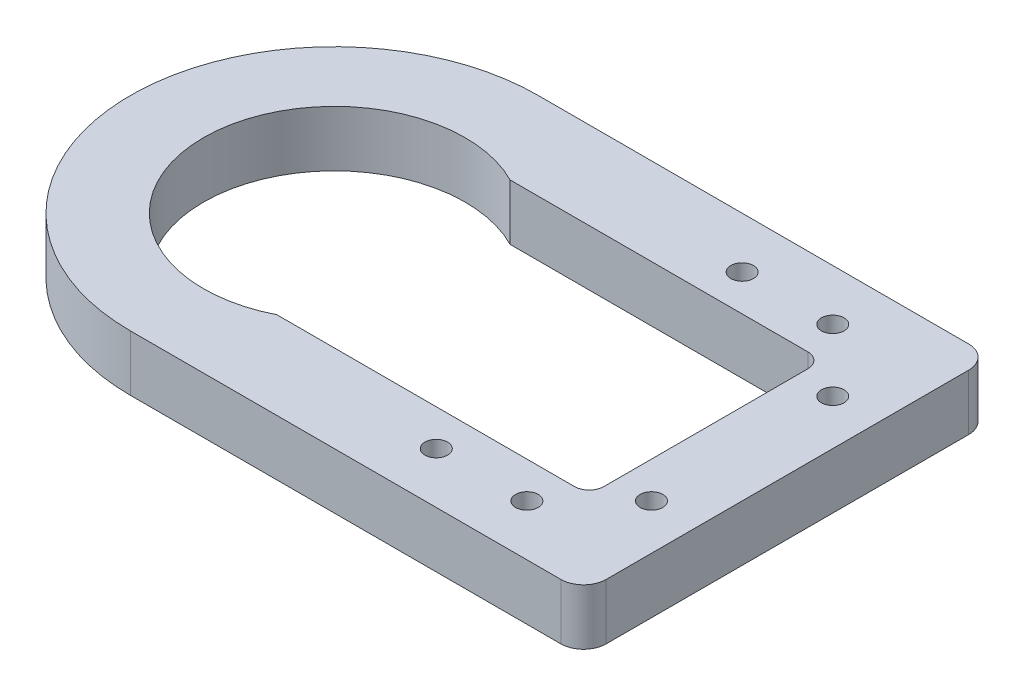
ISO-10303-21;
HEADER;
FILE_DESCRIPTION(('STEP AP214'),'2;1');
FILE_NAME('part.step','',(''),(''),'','','');
FILE_SCHEMA(('AUTOMOTIVE_DESIGN { 1 0 10303 214 1 1 1 1 }'));
ENDSEC;
DATA;
#1=APPLICATION_CONTEXT('core data for automotive mechanical design processes');
#2=APPLICATION_PROTOCOL_DEFINITION('international standard','automotive_design',2000,#1);
#3=PRODUCT_CONTEXT('',#1,'mechanical');
#4=PRODUCT('Part','Part','',(#3));
#5=PRODUCT_RELATED_PRODUCT_CATEGORY('part','',(#4));
#6=PRODUCT_DEFINITION_FORMATION('','',#4);
#7=PRODUCT_DEFINITION_CONTEXT('part definition',#1,'design');
#8=PRODUCT_DEFINITION('design','',#6,#7);
#9=PRODUCT_DEFINITION_SHAPE('','',#8);
#10=(LENGTH_UNIT() NAMED_UNIT(*) SI_UNIT(.MILLI.,.METRE.));
#11=(NAMED_UNIT(*) PLANE_ANGLE_UNIT() SI_UNIT($,.RADIAN.));
#12=(NAMED_UNIT(*) SI_UNIT($,.STERADIAN.) SOLID_ANGLE_UNIT());
#13=UNCERTAINTY_MEASURE_WITH_UNIT(LENGTH_MEASURE(1.E-05),#10,'distance_accuracy_value','');
#14=(GEOMETRIC_REPRESENTATION_CONTEXT(3) GLOBAL_UNCERTAINTY_ASSIGNED_CONTEXT((#13)) GLOBAL_UNIT_ASSIGNED_CONTEXT((#10,
#11,#12)) REPRESENTATION_CONTEXT('',''));
#15=CARTESIAN_POINT('',(0.,0.,0.));
#16=DIRECTION('',(0.,0.,1.));
#17=DIRECTION('',(1.,0.,0.));
#18=AXIS2_PLACEMENT_3D('',#15,#16,#17);
#19=CARTESIAN_POINT('',(-18.0100000019727,4.9304,-1.09601216990995E-09));
#20=DIRECTION('',(0.,1.,0.));
#21=DIRECTION('',(0.,0.,1.));
#22=AXIS2_PLACEMENT_3D('',#19,#20,#21);
#23=PLANE('',#22);
#24=CARTESIAN_POINT('',(22.5001886971539,4.9304,-13.5001144870717));
#25=DIRECTION('',(0.,-1.,0.));
#26=DIRECTION('',(-1.,0.,0.));
#27=AXIS2_PLACEMENT_3D('',#24,#25,#26);
#28=CIRCLE('',#27,0.999999999999983);
#29=CARTESIAN_POINT('',(23.5001886971539,4.9304,-13.5001144870717));
#30=VERTEX_POINT('',#29);
#31=EDGE_CURVE('E20',#30,#30,#28,.T.);
#32=ORIENTED_EDGE('',*,*,#31,.T.);
#33=EDGE_LOOP('',(#32));
#34=FACE_BOUND('',#33,.T.);
#35=CARTESIAN_POINT('',(22.5001886971539,4.9304,13.4998855129283));
#36=DIRECTION('',(0.,-1.,0.));
#37=DIRECTION('',(-1.,0.,0.));
#38=AXIS2_PLACEMENT_3D('',#35,#36,#37);
#39=CIRCLE('',#38,0.999999999999983);
#40=CARTESIAN_POINT('',(23.5001886971539,4.9304,13.4998855129283));
#41=VERTEX_POINT('',#40);
#42=EDGE_CURVE('E96',#41,#41,#39,.T.);
#43=ORIENTED_EDGE('',*,*,#42,.T.);
#44=EDGE_LOOP('',(#43));
#45=FACE_BOUND('',#44,.T.);
#46=CARTESIAN_POINT('',(30.5001886971539,4.9304,-13.5001144870717));
#47=DIRECTION('',(0.,-1.,0.));
#48=DIRECTION('',(-1.,0.,0.));
#49=AXIS2_PLACEMENT_3D('',#46,#47,#48);
#50=CIRCLE('',#49,1.0000000000001);
#51=CARTESIAN_POINT('',(31.500188697154,4.9304,-13.5001144870717));
#52=VERTEX_POINT('',#51);
#53=EDGE_CURVE('E198',#52,#52,#50,.T.);
#54=ORIENTED_EDGE('',*,*,#53,.T.);
#55=EDGE_LOOP('',(#54));
#56=FACE_BOUND('',#55,.T.);
#57=CARTESIAN_POINT('',(36.0001886971538,4.9304,-8.00011448707169));
#58=DIRECTION('',(0.,-1.,0.));
#59=DIRECTION('',(-1.,0.,0.));
#60=AXIS2_PLACEMENT_3D('',#57,#58,#59);
#61=CIRCLE('',#60,0.999999999999908);
#62=CARTESIAN_POINT('',(37.0001886971537,4.9304,-8.0001144870717));
#63=VERTEX_POINT('',#62);
#64=EDGE_CURVE('E228',#63,#63,#61,.T.);
#65=ORIENTED_EDGE('',*,*,#64,.T.);
#66=EDGE_LOOP('',(#65));
#67=FACE_BOUND('',#66,.T.);
#68=CARTESIAN_POINT('',(30.5001886971539,4.9304,13.4998855129283));
#69=DIRECTION('',(0.,-1.,0.));
#70=DIRECTION('',(-1.,0.,0.));
#71=AXIS2_PLACEMENT_3D('',#68,#69,#70);
#72=CIRCLE('',#71,1.00000000000011);
#73=CARTESIAN_POINT('',(31.500188697154,4.9304,13.4998855129283));
#74=VERTEX_POINT('',#73);
#75=EDGE_CURVE('E182',#74,#74,#72,.T.);
#76=ORIENTED_EDGE('',*,*,#75,.T.);
#77=EDGE_LOOP('',(#76));
#78=FACE_BOUND('',#77,.T.);
#79=CARTESIAN_POINT('',(36.0001886971538,4.9304,7.99988551292829));
#80=DIRECTION('',(0.,-1.,0.));
#81=DIRECTION('',(-1.,0.,0.));
#82=AXIS2_PLACEMENT_3D('',#79,#80,#81);
#83=CIRCLE('',#82,0.999999999999885);
#84=CARTESIAN_POINT('',(37.0001886971537,4.9304,7.99988551292829));
#85=VERTEX_POINT('',#84);
#86=EDGE_CURVE('E208',#85,#85,#83,.T.);
#87=ORIENTED_EDGE('',*,*,#86,.T.);
#88=EDGE_LOOP('',(#87));
#89=FACE_BOUND('',#88,.T.);
#90=CARTESIAN_POINT('',(0.,4.9304,-1.96509475358653E-12));
#91=DIRECTION('',(0.,-1.,0.));
#92=DIRECTION('',(0.452458420498872,0.,-0.891785499837077));
#93=AXIS2_PLACEMENT_3D('',#90,#91,#92);
#94=CIRCLE('',#93,11.5499909828917);
#95=CARTESIAN_POINT('',(5.22634193926225,4.9304,10.2998855158078));
#96=VERTEX_POINT('',#95);
#97=CARTESIAN_POINT('',(5.22589067689541,4.9304,-10.3001144817938));
#98=VERTEX_POINT('',#97);
#99=EDGE_CURVE('E186',#96,#98,#94,.T.);
#100=ORIENTED_EDGE('',*,*,#99,.T.);
#101=DIRECTION('',(1.,0.,-2.00831132028612E-10));
#102=VECTOR('',#101,1.);
#103=CARTESIAN_POINT('',(0.176519849998757,4.9304,-10.3001144807797));
#104=LINE('',#103,#102);
#105=CARTESIAN_POINT('',(31.5001887311821,4.9304,-10.3001144870705));
#106=VERTEX_POINT('',#105);
#107=EDGE_CURVE('E181',#98,#106,#104,.T.);
#108=ORIENTED_EDGE('',*,*,#107,.T.);
#109=CARTESIAN_POINT('',(31.5001886971546,4.9304,-9.0001144870712));
#110=DIRECTION('',(0.,-1.,0.));
#111=DIRECTION('',(1.,0.,2.42301905036031E-11));
#112=AXIS2_PLACEMENT_3D('',#109,#110,#111);
#113=CIRCLE('',#112,1.29999999999921);
#114=CARTESIAN_POINT('',(32.8001886971538,4.9304,-9.0001144870397));
#115=VERTEX_POINT('',#114);
#116=EDGE_CURVE('E75',#106,#115,#113,.T.);
#117=ORIENTED_EDGE('',*,*,#116,.T.);
#118=DIRECTION('',(-1.103675047943E-10,0.,1.));
#119=VECTOR('',#118,1.);
#120=CARTESIAN_POINT('',(32.8001886961607,4.9304,-5.72329382744409E-05));
#121=LINE('',#120,#119);
#122=CARTESIAN_POINT('',(32.8001886951673,4.9304,8.99988554626301));
#123=VERTEX_POINT('',#122);
#124=EDGE_CURVE('E156',#115,#123,#121,.T.);
#125=ORIENTED_EDGE('',*,*,#124,.T.);
#126=CARTESIAN_POINT('',(31.5001886951672,4.9304,8.99988551292821));
#127=DIRECTION('',(0.,-1.,0.));
#128=DIRECTION('',(0.,0.,1.));
#129=AXIS2_PLACEMENT_3D('',#126,#127,#128);
#130=CIRCLE('',#129,1.30000000000008);
#131=CARTESIAN_POINT('',(31.5001886951672,4.9304,10.2998855129283));
#132=VERTEX_POINT('',#131);
#133=EDGE_CURVE('E144',#123,#132,#130,.T.);
#134=ORIENTED_EDGE('',*,*,#133,.T.);
#135=DIRECTION('',(-1.,0.,1.09595282378894E-10));
#136=VECTOR('',#135,1.);
#137=CARTESIAN_POINT('',(0.176632658185377,4.9304,10.2998855163613));
#138=LINE('',#137,#136);
#139=EDGE_CURVE('E174',#132,#96,#138,.T.);
#140=ORIENTED_EDGE('',*,*,#139,.T.);
#141=EDGE_LOOP('',(#100,#108,#117,#125,#134,#140));
#142=FACE_BOUND('',#141,.T.);
#143=DIRECTION('',(1.,0.,-1.09599453254686E-10));
#144=VECTOR('',#143,1.);
#145=CARTESIAN_POINT('',(0.495000000493232,4.9304,17.9999999999458));
#146=LINE('',#145,#144);
#147=CARTESIAN_POINT('',(1.97275797694102E-09,4.9304,18.));
#148=VERTEX_POINT('',#147);
#149=CARTESIAN_POINT('',(38.,4.9304,17.9999999958352));
#150=VERTEX_POINT('',#149);
#151=EDGE_CURVE('E11',#148,#150,#146,.T.);
#152=ORIENTED_EDGE('',*,*,#151,.T.);
#153=CARTESIAN_POINT('',(37.9999999998903,4.9304,15.9999999959448));
#154=DIRECTION('',(0.,1.,0.));
#155=DIRECTION('',(5.48006084984981E-11,0.,1.));
#156=AXIS2_PLACEMENT_3D('',#153,#154,#155);
#157=CIRCLE('',#156,1.9999999998905);
#158=CARTESIAN_POINT('',(39.9999999997808,4.9304,15.999999995616));
#159=VERTEX_POINT('',#158);
#160=EDGE_CURVE('E172',#150,#159,#157,.T.);
#161=ORIENTED_EDGE('',*,*,#160,.T.);
#162=DIRECTION('',(-1.09595863510827E-10,0.,-1.));
#163=VECTOR('',#162,1.);
#164=CARTESIAN_POINT('',(39.9999999980272,4.9304,-5.91881514720845E-09));
#165=LINE('',#164,#163);
#166=CARTESIAN_POINT('',(39.9999999962736,4.9304,-16.000000004384));
#167=VERTEX_POINT('',#166);
#168=EDGE_CURVE('E166',#159,#167,#165,.T.);
#169=ORIENTED_EDGE('',*,*,#168,.T.);
#170=CARTESIAN_POINT('',(37.9999999962735,4.9304,-16.0000000041648));
#171=DIRECTION('',(0.,1.,0.));
#172=DIRECTION('',(1.,0.,-1.09602327214015E-10));
#173=AXIS2_PLACEMENT_3D('',#170,#171,#172);
#174=CIRCLE('',#173,2.0000000000001);
#175=CARTESIAN_POINT('',(37.9999999962737,4.9304,-18.0000000041647));
#176=VERTEX_POINT('',#175);
#177=EDGE_CURVE('E194',#167,#176,#174,.T.);
#178=ORIENTED_EDGE('',*,*,#177,.T.);
#179=DIRECTION('',(-1.,0.,1.09600095676636E-10));
#180=VECTOR('',#179,1.);
#181=CARTESIAN_POINT('',(0.494999996602441,4.9304,-18.0000000000542));
#182=LINE('',#181,#180);
#183=CARTESIAN_POINT('',(-1.97276884064679E-09,4.9304,-18.));
#184=VERTEX_POINT('',#183);
#185=EDGE_CURVE('E236',#176,#184,#182,.T.);
#186=ORIENTED_EDGE('',*,*,#185,.T.);
#187=CARTESIAN_POINT('',(0.,4.9304,0.));
#188=DIRECTION('',(0.,1.,0.));
#189=DIRECTION('',(-1.09599780714268E-10,0.,-1.));
#190=AXIS2_PLACEMENT_3D('',#187,#188,#189);
#191=CIRCLE('',#190,18.);
#192=EDGE_CURVE('E205',#184,#148,#191,.T.);
#193=ORIENTED_EDGE('',*,*,#192,.T.);
#194=EDGE_LOOP('',(#152,#161,#169,#178,#186,#193));
#195=FACE_BOUND('',#194,.T.);
#196=ADVANCED_FACE('F16',(#34,#45,#56,#67,#78,#89,#142,#195),#23,.T.);
#197=CARTESIAN_POINT('',(-18.0100000019727,0.,-1.09600772901786E-09));
#198=DIRECTION('',(0.,-1.,0.));
#199=DIRECTION('',(0.,0.,-1.));
#200=AXIS2_PLACEMENT_3D('',#197,#198,#199);
#201=PLANE('',#200);
#202=CARTESIAN_POINT('',(22.5001886971539,0.,-13.5001144870717));
#203=DIRECTION('',(0.,1.,0.));
#204=DIRECTION('',(-0.813826036051077,0.,-0.581108581114917));
#205=AXIS2_PLACEMENT_3D('',#202,#203,#204);
#206=CIRCLE('',#205,1.);
#207=CARTESIAN_POINT('',(21.5001886971539,0.,-13.5001144870717));
#208=VERTEX_POINT('',#207);
#209=EDGE_CURVE('E243',#208,#208,#206,.T.);
#210=ORIENTED_EDGE('',*,*,#209,.T.);
#211=EDGE_LOOP('',(#210));
#212=FACE_BOUND('',#211,.T.);
#213=CARTESIAN_POINT('',(22.5001886971539,0.,13.4998855129284));
#214=DIRECTION('',(0.,1.,0.));
#215=DIRECTION('',(-0.813826036051071,0.,-0.581108581114924));
#216=AXIS2_PLACEMENT_3D('',#213,#214,#215);
#217=CIRCLE('',#216,1.);
#218=CARTESIAN_POINT('',(21.5001886971539,0.,13.4998855129283));
#219=VERTEX_POINT('',#218);
#220=EDGE_CURVE('E87',#219,#219,#217,.T.);
#221=ORIENTED_EDGE('',*,*,#220,.T.);
#222=EDGE_LOOP('',(#221));
#223=FACE_BOUND('',#222,.T.);
#224=CARTESIAN_POINT('',(30.5001886971539,0.,-13.5001144870716));
#225=DIRECTION('',(0.,1.,0.));
#226=DIRECTION('',(-0.81382603605107,0.,-0.581108581114926));
#227=AXIS2_PLACEMENT_3D('',#224,#225,#226);
#228=CIRCLE('',#227,1.00000000000006);
#229=CARTESIAN_POINT('',(29.5001886971539,0.,-13.5001144870717));
#230=VERTEX_POINT('',#229);
#231=EDGE_CURVE('E196',#230,#230,#228,.T.);
#232=ORIENTED_EDGE('',*,*,#231,.T.);
#233=EDGE_LOOP('',(#232));
#234=FACE_BOUND('',#233,.T.);
#235=CARTESIAN_POINT('',(36.0001886971539,0.,-8.00011448707171));
#236=DIRECTION('',(0.,1.,0.));
#237=DIRECTION('',(-0.813826036051058,0.,-0.581108581114943));
#238=AXIS2_PLACEMENT_3D('',#235,#236,#237);
#239=CIRCLE('',#238,0.999999999999947);
#240=CARTESIAN_POINT('',(35.000188697154,0.,-8.00011448707169));
#241=VERTEX_POINT('',#240);
#242=EDGE_CURVE('E226',#241,#241,#239,.T.);
#243=ORIENTED_EDGE('',*,*,#242,.T.);
#244=EDGE_LOOP('',(#243));
#245=FACE_BOUND('',#244,.T.);
#246=CARTESIAN_POINT('',(30.5001886971539,0.,13.4998855129284));
#247=DIRECTION('',(0.,1.,0.));
#248=DIRECTION('',(-0.813826036051069,0.,-0.581108581114928));
#249=AXIS2_PLACEMENT_3D('',#246,#247,#248);
#250=CIRCLE('',#249,1.00000000000005);
#251=CARTESIAN_POINT('',(29.5001886971539,0.,13.4998855129283));
#252=VERTEX_POINT('',#251);
#253=EDGE_CURVE('E184',#252,#252,#250,.T.);
#254=ORIENTED_EDGE('',*,*,#253,.T.);
#255=EDGE_LOOP('',(#254));
#256=FACE_BOUND('',#255,.T.);
#257=CARTESIAN_POINT('',(36.0001886971538,0.,7.99988551292829));
#258=DIRECTION('',(0.,1.,0.));
#259=DIRECTION('',(-0.813826036051057,0.,-0.581108581114945));
#260=AXIS2_PLACEMENT_3D('',#257,#258,#259);
#261=CIRCLE('',#260,0.999999999999944);
#262=CARTESIAN_POINT('',(35.000188697154,0.,7.99988551292829));
#263=VERTEX_POINT('',#262);
#264=EDGE_CURVE('E185',#263,#263,#261,.T.);
#265=ORIENTED_EDGE('',*,*,#264,.T.);
#266=EDGE_LOOP('',(#265));
#267=FACE_BOUND('',#266,.T.);
#268=CARTESIAN_POINT('',(0.,0.,-1.95621296938953E-12));
#269=DIRECTION('',(0.,1.,0.));
#270=DIRECTION('',(0.452497490864166,0.,0.891765675927053));
#271=AXIS2_PLACEMENT_3D('',#268,#269,#270);
#272=CIRCLE('',#271,11.5499909828917);
#273=CARTESIAN_POINT('',(5.22589067689541,0.,-10.3001144817938));
#274=VERTEX_POINT('',#273);
#275=CARTESIAN_POINT('',(5.22634193926225,0.,10.2998855158078));
#276=VERTEX_POINT('',#275);
#277=EDGE_CURVE('E199',#274,#276,#272,.T.);
#278=ORIENTED_EDGE('',*,*,#277,.T.);
#279=DIRECTION('',(1.,0.,-1.09595463787011E-10));
#280=VECTOR('',#279,1.);
#281=CARTESIAN_POINT('',(5.22634193926225,0.,10.2998855158078));
#282=LINE('',#281,#280);
#283=CARTESIAN_POINT('',(31.5001886951672,0.,10.2998855129283));
#284=VERTEX_POINT('',#283);
#285=EDGE_CURVE('E154',#276,#284,#282,.T.);
#286=ORIENTED_EDGE('',*,*,#285,.T.);
#287=CARTESIAN_POINT('',(31.5001886951673,0.,8.99988551292828));
#288=DIRECTION('',(0.,1.,0.));
#289=DIRECTION('',(1.,0.,2.56420987007834E-08));
#290=AXIS2_PLACEMENT_3D('',#287,#288,#289);
#291=CIRCLE('',#290,1.3);
#292=CARTESIAN_POINT('',(32.8001886951673,0.,8.99988554626301));
#293=VERTEX_POINT('',#292);
#294=EDGE_CURVE('E159',#284,#293,#291,.T.);
#295=ORIENTED_EDGE('',*,*,#294,.T.);
#296=DIRECTION('',(1.103628297817E-10,0.,-1.));
#297=VECTOR('',#296,1.);
#298=CARTESIAN_POINT('',(32.8001886951673,0.,8.99988554626301));
#299=LINE('',#298,#297);
#300=CARTESIAN_POINT('',(32.8001886971538,0.,-9.0001144870397));
#301=VERTEX_POINT('',#300);
#302=EDGE_CURVE('E64',#293,#301,#299,.T.);
#303=ORIENTED_EDGE('',*,*,#302,.T.);
#304=CARTESIAN_POINT('',(31.5001886971545,0.,-9.00011448707114));
#305=DIRECTION('',(0.,1.,0.));
#306=DIRECTION('',(2.61750791981399E-08,0.,-1.));
#307=AXIS2_PLACEMENT_3D('',#304,#305,#306);
#308=CIRCLE('',#307,1.29999999999935);
#309=CARTESIAN_POINT('',(31.5001887311821,0.,-10.3001144870705));
#310=VERTEX_POINT('',#309);
#311=EDGE_CURVE('E178',#301,#310,#308,.T.);
#312=ORIENTED_EDGE('',*,*,#311,.T.);
#313=DIRECTION('',(-1.,0.,2.00831210286976E-10));
#314=VECTOR('',#313,1.);
#315=CARTESIAN_POINT('',(31.5001887311821,0.,-10.3001144870705));
#316=LINE('',#315,#314);
#317=EDGE_CURVE('E214',#310,#274,#316,.T.);
#318=ORIENTED_EDGE('',*,*,#317,.T.);
#319=EDGE_LOOP('',(#278,#286,#295,#303,#312,#318));
#320=FACE_BOUND('',#319,.T.);
#321=DIRECTION('',(-1.,0.,1.09599697744126E-10));
#322=VECTOR('',#321,1.);
#323=CARTESIAN_POINT('',(38.,0.,17.9999999958352));
#324=LINE('',#323,#322);
#325=CARTESIAN_POINT('',(38.,0.,17.9999999958352));
#326=VERTEX_POINT('',#325);
#327=CARTESIAN_POINT('',(1.97275844097955E-09,0.,18.));
#328=VERTEX_POINT('',#327);
#329=EDGE_CURVE('E26',#326,#328,#324,.T.);
#330=ORIENTED_EDGE('',*,*,#329,.T.);
#331=CARTESIAN_POINT('',(0.,0.,0.));
#332=DIRECTION('',(0.,-1.,0.));
#333=DIRECTION('',(-1.09599966445788E-10,0.,-1.));
#334=AXIS2_PLACEMENT_3D('',#331,#332,#333);
#335=CIRCLE('',#334,18.);
#336=CARTESIAN_POINT('',(-1.97276906616084E-09,0.,-18.));
#337=VERTEX_POINT('',#336);
#338=EDGE_CURVE('E206',#328,#337,#335,.T.);
#339=ORIENTED_EDGE('',*,*,#338,.T.);
#340=DIRECTION('',(1.,0.,-1.09599639310702E-10));
#341=VECTOR('',#340,1.);
#342=CARTESIAN_POINT('',(-1.97276906616084E-09,0.,-18.));
#343=LINE('',#342,#341);
#344=CARTESIAN_POINT('',(37.9999999962737,0.,-18.0000000041647));
#345=VERTEX_POINT('',#344);
#346=EDGE_CURVE('E231',#337,#345,#343,.T.);
#347=ORIENTED_EDGE('',*,*,#346,.T.);
#348=CARTESIAN_POINT('',(37.9999999962736,0.,-16.0000000041648));
#349=DIRECTION('',(0.,-1.,0.));
#350=DIRECTION('',(1.,0.,-1.09566800077236E-10));
#351=AXIS2_PLACEMENT_3D('',#348,#349,#350);
#352=CIRCLE('',#351,1.99999999999993);
#353=CARTESIAN_POINT('',(39.9999999962736,0.,-16.000000004384));
#354=VERTEX_POINT('',#353);
#355=EDGE_CURVE('E191',#345,#354,#352,.T.);
#356=ORIENTED_EDGE('',*,*,#355,.T.);
#357=DIRECTION('',(1.09601078213117E-10,0.,1.));
#358=VECTOR('',#357,1.);
#359=CARTESIAN_POINT('',(39.9999999962736,0.,-16.000000004384));
#360=LINE('',#359,#358);
#361=CARTESIAN_POINT('',(39.9999999997808,0.,15.999999995616));
#362=VERTEX_POINT('',#361);
#363=EDGE_CURVE('E169',#354,#362,#360,.T.);
#364=ORIENTED_EDGE('',*,*,#363,.T.);
#365=CARTESIAN_POINT('',(37.9999999998902,0.,15.9999999959447));
#366=DIRECTION('',(0.,-1.,0.));
#367=DIRECTION('',(5.48117107287434E-11,0.,1.));
#368=AXIS2_PLACEMENT_3D('',#365,#366,#367);
#369=CIRCLE('',#368,1.99999999989056);
#370=EDGE_CURVE('E177',#362,#326,#369,.T.);
#371=ORIENTED_EDGE('',*,*,#370,.T.);
#372=EDGE_LOOP('',(#330,#339,#347,#356,#364,#371));
#373=FACE_BOUND('',#372,.T.);
#374=ADVANCED_FACE('F260',(#212,#223,#234,#245,#256,#267,#320,#373),#201,.T.);
#375=CARTESIAN_POINT('',(19.0000000009865,-0.01,17.9999999979177));
#376=DIRECTION('',(1.09599453254686E-10,0.,1.));
#377=DIRECTION('',(1.,0.,-1.09599453254686E-10));
#378=AXIS2_PLACEMENT_3D('',#375,#376,#377);
#379=PLANE('',#378);
#380=ORIENTED_EDGE('',*,*,#329,.F.);
#381=DIRECTION('',(0.,1.,0.));
#382=VECTOR('',#381,1.);
#383=CARTESIAN_POINT('',(38.,0.,17.9999999958352));
#384=LINE('',#383,#382);
#385=EDGE_CURVE('E170',#326,#150,#384,.T.);
#386=ORIENTED_EDGE('',*,*,#385,.T.);
#387=ORIENTED_EDGE('',*,*,#151,.F.);
#388=DIRECTION('',(0.,1.,0.));
#389=VECTOR('',#388,1.);
#390=CARTESIAN_POINT('',(1.97275844097955E-09,0.,18.));
#391=LINE('',#390,#389);
#392=EDGE_CURVE('E202',#328,#148,#391,.T.);
#393=ORIENTED_EDGE('',*,*,#392,.F.);
#394=EDGE_LOOP('',(#380,#386,#387,#393));
#395=FACE_BOUND('',#394,.T.);
#396=ADVANCED_FACE('F302',(#395),#379,.T.);
#397=CARTESIAN_POINT('',(37.9999999998903,1.5,15.9999999959448));
#398=DIRECTION('',(0.,-1.,0.));
#399=DIRECTION('',(5.48006084984981E-11,0.,1.));
#400=AXIS2_PLACEMENT_3D('',#397,#398,#399);
#401=CYLINDRICAL_SURFACE('',#400,1.9999999998905);
#402=ORIENTED_EDGE('',*,*,#370,.F.);
#403=DIRECTION('',(0.,1.,0.));
#404=VECTOR('',#403,1.);
#405=CARTESIAN_POINT('',(39.9999999997808,0.,15.999999995616));
#406=LINE('',#405,#404);
#407=EDGE_CURVE('E168',#362,#159,#406,.T.);
#408=ORIENTED_EDGE('',*,*,#407,.T.);
#409=ORIENTED_EDGE('',*,*,#160,.F.);
#410=ORIENTED_EDGE('',*,*,#385,.F.);
#411=EDGE_LOOP('',(#402,#408,#409,#410));
#412=FACE_BOUND('',#411,.T.);
#413=ADVANCED_FACE('F291',(#412),#401,.T.);
#414=CARTESIAN_POINT('',(39.9999999980272,-0.01,-4.3839620822439E-09));
#415=DIRECTION('',(1.,0.,-1.09595863510827E-10));
#416=DIRECTION('',(-1.09595863510827E-10,0.,-1.));
#417=AXIS2_PLACEMENT_3D('',#414,#415,#416);
#418=PLANE('',#417);
#419=ORIENTED_EDGE('',*,*,#363,.F.);
#420=DIRECTION('',(0.,1.,0.));
#421=VECTOR('',#420,1.);
#422=CARTESIAN_POINT('',(39.9999999962736,0.,-16.000000004384));
#423=LINE('',#422,#421);
#424=EDGE_CURVE('E240',#354,#167,#423,.T.);
#425=ORIENTED_EDGE('',*,*,#424,.T.);
#426=ORIENTED_EDGE('',*,*,#168,.F.);
#427=ORIENTED_EDGE('',*,*,#407,.F.);
#428=EDGE_LOOP('',(#419,#425,#426,#427));
#429=FACE_BOUND('',#428,.T.);
#430=ADVANCED_FACE('F277',(#429),#418,.T.);
#431=CARTESIAN_POINT('',(37.9999999962735,1.5,-16.0000000041648));
#432=DIRECTION('',(0.,-1.,0.));
#433=DIRECTION('',(1.,0.,-1.09602327214015E-10));
#434=AXIS2_PLACEMENT_3D('',#431,#432,#433);
#435=CYLINDRICAL_SURFACE('',#434,2.0000000000001);
#436=ORIENTED_EDGE('',*,*,#355,.F.);
#437=DIRECTION('',(0.,1.,0.));
#438=VECTOR('',#437,1.);
#439=CARTESIAN_POINT('',(37.9999999962737,0.,-18.0000000041647));
#440=LINE('',#439,#438);
#441=EDGE_CURVE('E195',#345,#176,#440,.T.);
#442=ORIENTED_EDGE('',*,*,#441,.T.);
#443=ORIENTED_EDGE('',*,*,#177,.F.);
#444=ORIENTED_EDGE('',*,*,#424,.F.);
#445=EDGE_LOOP('',(#436,#442,#443,#444));
#446=FACE_BOUND('',#445,.T.);
#447=ADVANCED_FACE('F281',(#446),#435,.T.);
#448=CARTESIAN_POINT('',(18.9999999971505,-0.01,-18.0000000020824));
#449=DIRECTION('',(-1.09600095676636E-10,0.,-1.));
#450=DIRECTION('',(-1.,0.,1.09600095676636E-10));
#451=AXIS2_PLACEMENT_3D('',#448,#449,#450);
#452=PLANE('',#451);
#453=ORIENTED_EDGE('',*,*,#346,.F.);
#454=DIRECTION('',(0.,1.,0.));
#455=VECTOR('',#454,1.);
#456=CARTESIAN_POINT('',(-1.97276906616084E-09,0.,-18.));
#457=LINE('',#456,#455);
#458=EDGE_CURVE('E216',#337,#184,#457,.T.);
#459=ORIENTED_EDGE('',*,*,#458,.T.);
#460=ORIENTED_EDGE('',*,*,#185,.F.);
#461=ORIENTED_EDGE('',*,*,#441,.F.);
#462=EDGE_LOOP('',(#453,#459,#460,#461));
#463=FACE_BOUND('',#462,.T.);
#464=ADVANCED_FACE('F266',(#463),#452,.T.);
#465=CARTESIAN_POINT('',(0.,1.5,0.));
#466=DIRECTION('',(0.,-1.,0.));
#467=DIRECTION('',(-1.09599780714268E-10,0.,-1.));
#468=AXIS2_PLACEMENT_3D('',#465,#466,#467);
#469=CYLINDRICAL_SURFACE('',#468,18.);
#470=ORIENTED_EDGE('',*,*,#338,.F.);
#471=ORIENTED_EDGE('',*,*,#392,.T.);
#472=ORIENTED_EDGE('',*,*,#192,.F.);
#473=ORIENTED_EDGE('',*,*,#458,.F.);
#474=EDGE_LOOP('',(#470,#471,#472,#473));
#475=FACE_BOUND('',#474,.T.);
#476=ADVANCED_FACE('F270',(#475),#469,.T.);
#477=CARTESIAN_POINT('',(22.5001886971539,1.5,-13.5001144870717));
#478=DIRECTION('',(0.,-1.,0.));
#479=DIRECTION('',(-1.,0.,0.));
#480=AXIS2_PLACEMENT_3D('',#477,#478,#479);
#481=CYLINDRICAL_SURFACE('',#480,0.999999999999983);
#482=ORIENTED_EDGE('',*,*,#209,.F.);
#483=EDGE_LOOP('',(#482));
#484=FACE_BOUND('',#483,.T.);
#485=ORIENTED_EDGE('',*,*,#31,.F.);
#486=EDGE_LOOP('',(#485));
#487=FACE_BOUND('',#486,.T.);
#488=ADVANCED_FACE('F307',(#484,#487),#481,.F.);
#489=CARTESIAN_POINT('',(22.5001886971539,1.5,13.4998855129283));
#490=DIRECTION('',(0.,-1.,0.));
#491=DIRECTION('',(-1.,0.,0.));
#492=AXIS2_PLACEMENT_3D('',#489,#490,#491);
#493=CYLINDRICAL_SURFACE('',#492,0.999999999999983);
#494=ORIENTED_EDGE('',*,*,#220,.F.);
#495=EDGE_LOOP('',(#494));
#496=FACE_BOUND('',#495,.T.);
#497=ORIENTED_EDGE('',*,*,#42,.F.);
#498=EDGE_LOOP('',(#497));
#499=FACE_BOUND('',#498,.T.);
#500=ADVANCED_FACE('F475',(#496,#499),#493,.F.);
#501=CARTESIAN_POINT('',(30.5001886971539,1.5,-13.5001144870717));
#502=DIRECTION('',(0.,-1.,0.));
#503=DIRECTION('',(-1.,0.,0.));
#504=AXIS2_PLACEMENT_3D('',#501,#502,#503);
#505=CYLINDRICAL_SURFACE('',#504,1.0000000000001);
#506=ORIENTED_EDGE('',*,*,#231,.F.);
#507=EDGE_LOOP('',(#506));
#508=FACE_BOUND('',#507,.T.);
#509=ORIENTED_EDGE('',*,*,#53,.F.);
#510=EDGE_LOOP('',(#509));
#511=FACE_BOUND('',#510,.T.);
#512=ADVANCED_FACE('F324',(#508,#511),#505,.F.);
#513=CARTESIAN_POINT('',(36.0001886971538,1.5,-8.00011448707169));
#514=DIRECTION('',(0.,-1.,0.));
#515=DIRECTION('',(-1.,0.,0.));
#516=AXIS2_PLACEMENT_3D('',#513,#514,#515);
#517=CYLINDRICAL_SURFACE('',#516,0.999999999999908);
#518=ORIENTED_EDGE('',*,*,#242,.F.);
#519=EDGE_LOOP('',(#518));
#520=FACE_BOUND('',#519,.T.);
#521=ORIENTED_EDGE('',*,*,#64,.F.);
#522=EDGE_LOOP('',(#521));
#523=FACE_BOUND('',#522,.T.);
#524=ADVANCED_FACE('F321',(#520,#523),#517,.F.);
#525=CARTESIAN_POINT('',(30.5001886971539,1.5,13.4998855129283));
#526=DIRECTION('',(0.,-1.,0.));
#527=DIRECTION('',(-1.,0.,0.));
#528=AXIS2_PLACEMENT_3D('',#525,#526,#527);
#529=CYLINDRICAL_SURFACE('',#528,1.00000000000011);
#530=ORIENTED_EDGE('',*,*,#253,.F.);
#531=EDGE_LOOP('',(#530));
#532=FACE_BOUND('',#531,.T.);
#533=ORIENTED_EDGE('',*,*,#75,.F.);
#534=EDGE_LOOP('',(#533));
#535=FACE_BOUND('',#534,.T.);
#536=ADVANCED_FACE('F323',(#532,#535),#529,.F.);
#537=CARTESIAN_POINT('',(36.0001886971538,1.5,7.99988551292829));
#538=DIRECTION('',(0.,-1.,0.));
#539=DIRECTION('',(-1.,0.,0.));
#540=AXIS2_PLACEMENT_3D('',#537,#538,#539);
#541=CYLINDRICAL_SURFACE('',#540,0.999999999999885);
#542=ORIENTED_EDGE('',*,*,#264,.F.);
#543=EDGE_LOOP('',(#542));
#544=FACE_BOUND('',#543,.T.);
#545=ORIENTED_EDGE('',*,*,#86,.F.);
#546=EDGE_LOOP('',(#545));
#547=FACE_BOUND('',#546,.T.);
#548=ADVANCED_FACE('F326',(#544,#547),#541,.F.);
#549=CARTESIAN_POINT('',(18.3632653172147,-0.01,10.2998855143681));
#550=DIRECTION('',(-1.09595282378894E-10,0.,-1.));
#551=DIRECTION('',(-1.,0.,1.09595282378894E-10));
#552=AXIS2_PLACEMENT_3D('',#549,#550,#551);
#553=PLANE('',#552);
#554=ORIENTED_EDGE('',*,*,#285,.F.);
#555=DIRECTION('',(0.,1.,0.));
#556=VECTOR('',#555,1.);
#557=CARTESIAN_POINT('',(5.22634193926225,0.,10.2998855158078));
#558=LINE('',#557,#556);
#559=EDGE_CURVE('E188',#276,#96,#558,.T.);
#560=ORIENTED_EDGE('',*,*,#559,.T.);
#561=ORIENTED_EDGE('',*,*,#139,.F.);
#562=DIRECTION('',(0.,1.,0.));
#563=VECTOR('',#562,1.);
#564=CARTESIAN_POINT('',(31.5001886951672,0.,10.2998855129283));
#565=LINE('',#564,#563);
#566=EDGE_CURVE('E151',#284,#132,#565,.T.);
#567=ORIENTED_EDGE('',*,*,#566,.F.);
#568=EDGE_LOOP('',(#554,#560,#561,#567));
#569=FACE_BOUND('',#568,.T.);
#570=ADVANCED_FACE('F328',(#569),#553,.T.);
#571=CARTESIAN_POINT('',(31.5001886951672,1.5,8.99988551292821));
#572=DIRECTION('',(0.,-1.,0.));
#573=DIRECTION('',(0.,0.,1.));
#574=AXIS2_PLACEMENT_3D('',#571,#572,#573);
#575=CYLINDRICAL_SURFACE('',#574,1.30000000000008);
#576=ORIENTED_EDGE('',*,*,#294,.F.);
#577=ORIENTED_EDGE('',*,*,#566,.T.);
#578=ORIENTED_EDGE('',*,*,#133,.F.);
#579=DIRECTION('',(0.,1.,0.));
#580=VECTOR('',#579,1.);
#581=CARTESIAN_POINT('',(32.8001886951673,0.,8.99988554626301));
#582=LINE('',#581,#580);
#583=EDGE_CURVE('E149',#293,#123,#582,.T.);
#584=ORIENTED_EDGE('',*,*,#583,.F.);
#585=EDGE_LOOP('',(#576,#577,#578,#584));
#586=FACE_BOUND('',#585,.T.);
#587=ADVANCED_FACE('F147',(#586),#575,.F.);
#588=CARTESIAN_POINT('',(32.8001886961607,-0.01,-0.000114470388330456));
#589=DIRECTION('',(-1.,0.,-1.103675047943E-10));
#590=DIRECTION('',(-1.103675047943E-10,0.,1.));
#591=AXIS2_PLACEMENT_3D('',#588,#589,#590);
#592=PLANE('',#591);
#593=ORIENTED_EDGE('',*,*,#302,.F.);
#594=ORIENTED_EDGE('',*,*,#583,.T.);
#595=ORIENTED_EDGE('',*,*,#124,.F.);
#596=DIRECTION('',(0.,1.,0.));
#597=VECTOR('',#596,1.);
#598=CARTESIAN_POINT('',(32.8001886971538,0.,-9.0001144870397));
#599=LINE('',#598,#597);
#600=EDGE_CURVE('E180',#301,#115,#599,.T.);
#601=ORIENTED_EDGE('',*,*,#600,.F.);
#602=EDGE_LOOP('',(#593,#594,#595,#601));
#603=FACE_BOUND('',#602,.T.);
#604=ADVANCED_FACE('F161',(#603),#592,.T.);
#605=CARTESIAN_POINT('',(31.5001886971546,1.5,-9.0001144870712));
#606=DIRECTION('',(0.,-1.,0.));
#607=DIRECTION('',(1.,0.,2.42301905036031E-11));
#608=AXIS2_PLACEMENT_3D('',#605,#606,#607);
#609=CYLINDRICAL_SURFACE('',#608,1.29999999999921);
#610=ORIENTED_EDGE('',*,*,#311,.F.);
#611=ORIENTED_EDGE('',*,*,#600,.T.);
#612=ORIENTED_EDGE('',*,*,#116,.F.);
#613=DIRECTION('',(0.,1.,0.));
#614=VECTOR('',#613,1.);
#615=CARTESIAN_POINT('',(31.5001887311821,0.,-10.3001144870705));
#616=LINE('',#615,#614);
#617=EDGE_CURVE('E211',#310,#106,#616,.T.);
#618=ORIENTED_EDGE('',*,*,#617,.F.);
#619=EDGE_LOOP('',(#610,#611,#612,#618));
#620=FACE_BOUND('',#619,.T.);
#621=ADVANCED_FACE('F320',(#620),#609,.F.);
#622=CARTESIAN_POINT('',(18.3630397040389,-0.01,-10.3001144844321));
#623=DIRECTION('',(2.00831132028612E-10,0.,1.));
#624=DIRECTION('',(1.,0.,-2.00831132028612E-10));
#625=AXIS2_PLACEMENT_3D('',#622,#623,#624);
#626=PLANE('',#625);
#627=ORIENTED_EDGE('',*,*,#317,.F.);
#628=ORIENTED_EDGE('',*,*,#617,.T.);
#629=ORIENTED_EDGE('',*,*,#107,.F.);
#630=DIRECTION('',(0.,1.,0.));
#631=VECTOR('',#630,1.);
#632=CARTESIAN_POINT('',(5.22589067689541,0.,-10.3001144817938));
#633=LINE('',#632,#631);
#634=EDGE_CURVE('E189',#274,#98,#633,.T.);
#635=ORIENTED_EDGE('',*,*,#634,.F.);
#636=EDGE_LOOP('',(#627,#628,#629,#635));
#637=FACE_BOUND('',#636,.T.);
#638=ADVANCED_FACE('F18',(#637),#626,.T.);
#639=CARTESIAN_POINT('',(0.,1.5,-1.96509475358653E-12));
#640=DIRECTION('',(0.,-1.,0.));
#641=DIRECTION('',(0.452458420498872,0.,-0.891785499837077));
#642=AXIS2_PLACEMENT_3D('',#639,#640,#641);
#643=CYLINDRICAL_SURFACE('',#642,11.5499909828917);
#644=ORIENTED_EDGE('',*,*,#277,.F.);
#645=ORIENTED_EDGE('',*,*,#634,.T.);
#646=ORIENTED_EDGE('',*,*,#99,.F.);
#647=ORIENTED_EDGE('',*,*,#559,.F.);
#648=EDGE_LOOP('',(#644,#645,#646,#647));
#649=FACE_BOUND('',#648,.T.);
#650=ADVANCED_FACE('F311',(#649),#643,.F.);
#651=CLOSED_SHELL('',(#196,#374,#396,#413,#430,#447,#464,#476,#488,#500,#512,#524,#536,#548,
#570,#587,#604,#621,#638,#650));
#652=MANIFOLD_SOLID_BREP('B1',#651);
#653=ADVANCED_BREP_SHAPE_REPRESENTATION('',(#18,#652),#14);
#654=SHAPE_DEFINITION_REPRESENTATION(#9,#653);
ENDSEC;
END-ISO-10303-21;
